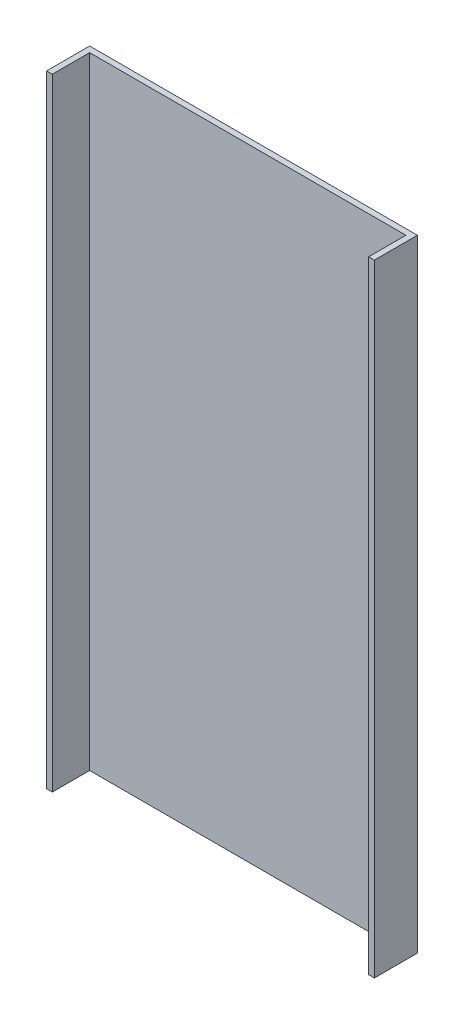
ISO-10303-21;
HEADER;
FILE_DESCRIPTION(('STEP AP214'),'2;1');
FILE_NAME('part.step','',(''),(''),'','','');
FILE_SCHEMA(('AUTOMOTIVE_DESIGN { 1 0 10303 214 1 1 1 1 }'));
ENDSEC;
DATA;
#1=APPLICATION_CONTEXT('core data for automotive mechanical design processes');
#2=APPLICATION_PROTOCOL_DEFINITION('international standard','automotive_design',2000,#1);
#3=PRODUCT_CONTEXT('',#1,'mechanical');
#4=PRODUCT('Part','Part','',(#3));
#5=PRODUCT_RELATED_PRODUCT_CATEGORY('part','',(#4));
#6=PRODUCT_DEFINITION_FORMATION('','',#4);
#7=PRODUCT_DEFINITION_CONTEXT('part definition',#1,'design');
#8=PRODUCT_DEFINITION('design','',#6,#7);
#9=PRODUCT_DEFINITION_SHAPE('','',#8);
#10=(LENGTH_UNIT() NAMED_UNIT(*) SI_UNIT(.MILLI.,.METRE.));
#11=(NAMED_UNIT(*) PLANE_ANGLE_UNIT() SI_UNIT($,.RADIAN.));
#12=(NAMED_UNIT(*) SI_UNIT($,.STERADIAN.) SOLID_ANGLE_UNIT());
#13=UNCERTAINTY_MEASURE_WITH_UNIT(LENGTH_MEASURE(1.E-05),#10,'distance_accuracy_value','');
#14=(GEOMETRIC_REPRESENTATION_CONTEXT(3) GLOBAL_UNCERTAINTY_ASSIGNED_CONTEXT((#13)) GLOBAL_UNIT_ASSIGNED_CONTEXT((#10,
#11,#12)) REPRESENTATION_CONTEXT('',''));
#15=CARTESIAN_POINT('',(0.,0.,0.));
#16=DIRECTION('',(0.,0.,1.));
#17=DIRECTION('',(1.,0.,0.));
#18=AXIS2_PLACEMENT_3D('',#15,#16,#17);
#19=CARTESIAN_POINT('',(0.,0.,1.27));
#20=DIRECTION('',(0.,0.,-1.));
#21=DIRECTION('',(-1.,0.,0.));
#22=AXIS2_PLACEMENT_3D('',#19,#20,#21);
#23=PLANE('',#22);
#24=DIRECTION('',(0.,1.,0.));
#25=VECTOR('',#24,1.);
#26=CARTESIAN_POINT('',(1.27,137.44,1.27));
#27=LINE('',#26,#25);
#28=CARTESIAN_POINT('',(1.27000000000001,0.,1.27));
#29=VERTEX_POINT('',#28);
#30=CARTESIAN_POINT('',(1.27,137.44,1.27));
#31=VERTEX_POINT('',#30);
#32=EDGE_CURVE('E59',#29,#31,#27,.T.);
#33=ORIENTED_EDGE('',*,*,#32,.F.);
#34=DIRECTION('',(1.,0.,0.));
#35=VECTOR('',#34,1.);
#36=CARTESIAN_POINT('',(0.,0.,1.27));
#37=LINE('',#36,#35);
#38=CARTESIAN_POINT('',(71.19,0.,1.27));
#39=VERTEX_POINT('',#38);
#40=EDGE_CURVE('E149',#29,#39,#37,.T.);
#41=ORIENTED_EDGE('',*,*,#40,.T.);
#42=DIRECTION('',(0.,-1.,0.));
#43=VECTOR('',#42,1.);
#44=CARTESIAN_POINT('',(71.19,0.,1.27));
#45=LINE('',#44,#43);
#46=CARTESIAN_POINT('',(71.19,137.44,1.27));
#47=VERTEX_POINT('',#46);
#48=EDGE_CURVE('E54',#47,#39,#45,.T.);
#49=ORIENTED_EDGE('',*,*,#48,.F.);
#50=DIRECTION('',(-1.,0.,0.));
#51=VECTOR('',#50,1.);
#52=CARTESIAN_POINT('',(0.,137.44,1.27));
#53=LINE('',#52,#51);
#54=EDGE_CURVE('E151',#47,#31,#53,.T.);
#55=ORIENTED_EDGE('',*,*,#54,.T.);
#56=EDGE_LOOP('',(#33,#41,#49,#55));
#57=FACE_BOUND('',#56,.T.);
#58=ADVANCED_FACE('F39',(#57),#23,.F.);
#59=CARTESIAN_POINT('',(0.,0.,1.27));
#60=DIRECTION('',(1.,0.,0.));
#61=DIRECTION('',(0.,0.,-1.));
#62=AXIS2_PLACEMENT_3D('',#59,#60,#61);
#63=PLANE('',#62);
#64=DIRECTION('',(0.,-1.,0.));
#65=VECTOR('',#64,1.);
#66=CARTESIAN_POINT('',(0.,0.,0.));
#67=LINE('',#66,#65);
#68=CARTESIAN_POINT('',(0.,137.44,0.));
#69=VERTEX_POINT('',#68);
#70=CARTESIAN_POINT('',(0.,0.,0.));
#71=VERTEX_POINT('',#70);
#72=EDGE_CURVE('E108',#69,#71,#67,.T.);
#73=ORIENTED_EDGE('',*,*,#72,.T.);
#74=DIRECTION('',(0.,0.,-1.));
#75=VECTOR('',#74,1.);
#76=CARTESIAN_POINT('',(0.,0.,1.27));
#77=LINE('',#76,#75);
#78=CARTESIAN_POINT('',(0.,0.,9.52));
#79=VERTEX_POINT('',#78);
#80=EDGE_CURVE('E11',#79,#71,#77,.T.);
#81=ORIENTED_EDGE('',*,*,#80,.F.);
#82=DIRECTION('',(0.,-1.,0.));
#83=VECTOR('',#82,1.);
#84=CARTESIAN_POINT('',(0.,137.44,9.52));
#85=LINE('',#84,#83);
#86=CARTESIAN_POINT('',(0.,137.44,9.52));
#87=VERTEX_POINT('',#86);
#88=EDGE_CURVE('E106',#87,#79,#85,.T.);
#89=ORIENTED_EDGE('',*,*,#88,.F.);
#90=DIRECTION('',(0.,0.,-1.));
#91=VECTOR('',#90,1.);
#92=CARTESIAN_POINT('',(0.,137.44,1.27));
#93=LINE('',#92,#91);
#94=EDGE_CURVE('E154',#87,#69,#93,.T.);
#95=ORIENTED_EDGE('',*,*,#94,.T.);
#96=EDGE_LOOP('',(#73,#81,#89,#95));
#97=FACE_BOUND('',#96,.T.);
#98=ADVANCED_FACE('F41',(#97),#63,.F.);
#99=CARTESIAN_POINT('',(0.,0.,1.27));
#100=DIRECTION('',(0.,1.,0.));
#101=DIRECTION('',(0.,0.,1.));
#102=AXIS2_PLACEMENT_3D('',#99,#100,#101);
#103=PLANE('',#102);
#104=DIRECTION('',(1.,0.,0.));
#105=VECTOR('',#104,1.);
#106=CARTESIAN_POINT('',(0.,0.,0.));
#107=LINE('',#106,#105);
#108=CARTESIAN_POINT('',(72.46,0.,0.));
#109=VERTEX_POINT('',#108);
#110=EDGE_CURVE('E156',#71,#109,#107,.T.);
#111=ORIENTED_EDGE('',*,*,#110,.T.);
#112=DIRECTION('',(0.,0.,-1.));
#113=VECTOR('',#112,1.);
#114=CARTESIAN_POINT('',(72.46,0.,1.27));
#115=LINE('',#114,#113);
#116=CARTESIAN_POINT('',(72.46,0.,9.52));
#117=VERTEX_POINT('',#116);
#118=EDGE_CURVE('E47',#117,#109,#115,.T.);
#119=ORIENTED_EDGE('',*,*,#118,.F.);
#120=DIRECTION('',(1.,0.,0.));
#121=VECTOR('',#120,1.);
#122=CARTESIAN_POINT('',(72.46,0.,9.52));
#123=LINE('',#122,#121);
#124=CARTESIAN_POINT('',(71.19,0.,9.52));
#125=VERTEX_POINT('',#124);
#126=EDGE_CURVE('E138',#125,#117,#123,.T.);
#127=ORIENTED_EDGE('',*,*,#126,.F.);
#128=DIRECTION('',(0.,0.,-1.));
#129=VECTOR('',#128,1.);
#130=CARTESIAN_POINT('',(71.19,0.,9.52));
#131=LINE('',#130,#129);
#132=EDGE_CURVE('E135',#125,#39,#131,.T.);
#133=ORIENTED_EDGE('',*,*,#132,.T.);
#134=ORIENTED_EDGE('',*,*,#40,.F.);
#135=DIRECTION('',(0.,0.,-1.));
#136=VECTOR('',#135,1.);
#137=CARTESIAN_POINT('',(1.27000000000001,0.,9.52));
#138=LINE('',#137,#136);
#139=CARTESIAN_POINT('',(1.27000000000001,0.,9.52));
#140=VERTEX_POINT('',#139);
#141=EDGE_CURVE('E114',#140,#29,#138,.T.);
#142=ORIENTED_EDGE('',*,*,#141,.F.);
#143=DIRECTION('',(1.,0.,0.));
#144=VECTOR('',#143,1.);
#145=CARTESIAN_POINT('',(0.,0.,9.52));
#146=LINE('',#145,#144);
#147=EDGE_CURVE('E111',#79,#140,#146,.T.);
#148=ORIENTED_EDGE('',*,*,#147,.F.);
#149=ORIENTED_EDGE('',*,*,#80,.T.);
#150=EDGE_LOOP('',(#111,#119,#127,#133,#134,#142,#148,#149));
#151=FACE_BOUND('',#150,.T.);
#152=ADVANCED_FACE('F112',(#151),#103,.F.);
#153=CARTESIAN_POINT('',(72.46,0.,1.27));
#154=DIRECTION('',(-1.,0.,0.));
#155=DIRECTION('',(0.,0.,1.));
#156=AXIS2_PLACEMENT_3D('',#153,#154,#155);
#157=PLANE('',#156);
#158=DIRECTION('',(0.,1.,0.));
#159=VECTOR('',#158,1.);
#160=CARTESIAN_POINT('',(72.46,0.,0.));
#161=LINE('',#160,#159);
#162=CARTESIAN_POINT('',(72.46,137.44,0.));
#163=VERTEX_POINT('',#162);
#164=EDGE_CURVE('E158',#109,#163,#161,.T.);
#165=ORIENTED_EDGE('',*,*,#164,.T.);
#166=DIRECTION('',(0.,0.,-1.));
#167=VECTOR('',#166,1.);
#168=CARTESIAN_POINT('',(72.46,137.44,1.27));
#169=LINE('',#168,#167);
#170=CARTESIAN_POINT('',(72.46,137.44,9.52));
#171=VERTEX_POINT('',#170);
#172=EDGE_CURVE('E162',#171,#163,#169,.T.);
#173=ORIENTED_EDGE('',*,*,#172,.F.);
#174=DIRECTION('',(0.,1.,0.));
#175=VECTOR('',#174,1.);
#176=CARTESIAN_POINT('',(72.46,0.,9.52));
#177=LINE('',#176,#175);
#178=EDGE_CURVE('E140',#117,#171,#177,.T.);
#179=ORIENTED_EDGE('',*,*,#178,.F.);
#180=ORIENTED_EDGE('',*,*,#118,.T.);
#181=EDGE_LOOP('',(#165,#173,#179,#180));
#182=FACE_BOUND('',#181,.T.);
#183=ADVANCED_FACE('F168',(#182),#157,.F.);
#184=CARTESIAN_POINT('',(0.,137.44,1.27));
#185=DIRECTION('',(0.,-1.,0.));
#186=DIRECTION('',(0.,0.,-1.));
#187=AXIS2_PLACEMENT_3D('',#184,#185,#186);
#188=PLANE('',#187);
#189=DIRECTION('',(-1.,0.,0.));
#190=VECTOR('',#189,1.);
#191=CARTESIAN_POINT('',(0.,137.44,0.));
#192=LINE('',#191,#190);
#193=EDGE_CURVE('E152',#163,#69,#192,.T.);
#194=ORIENTED_EDGE('',*,*,#193,.T.);
#195=ORIENTED_EDGE('',*,*,#94,.F.);
#196=DIRECTION('',(-1.,0.,0.));
#197=VECTOR('',#196,1.);
#198=CARTESIAN_POINT('',(0.,137.44,9.52));
#199=LINE('',#198,#197);
#200=CARTESIAN_POINT('',(1.27,137.44,9.52));
#201=VERTEX_POINT('',#200);
#202=EDGE_CURVE('E122',#201,#87,#199,.T.);
#203=ORIENTED_EDGE('',*,*,#202,.F.);
#204=DIRECTION('',(0.,0.,-1.));
#205=VECTOR('',#204,1.);
#206=CARTESIAN_POINT('',(1.27,137.44,9.52));
#207=LINE('',#206,#205);
#208=EDGE_CURVE('E127',#201,#31,#207,.T.);
#209=ORIENTED_EDGE('',*,*,#208,.T.);
#210=ORIENTED_EDGE('',*,*,#54,.F.);
#211=DIRECTION('',(0.,0.,-1.));
#212=VECTOR('',#211,1.);
#213=CARTESIAN_POINT('',(71.19,137.44,9.52));
#214=LINE('',#213,#212);
#215=CARTESIAN_POINT('',(71.19,137.44,9.52));
#216=VERTEX_POINT('',#215);
#217=EDGE_CURVE('E132',#216,#47,#214,.T.);
#218=ORIENTED_EDGE('',*,*,#217,.F.);
#219=DIRECTION('',(-1.,0.,0.));
#220=VECTOR('',#219,1.);
#221=CARTESIAN_POINT('',(72.46,137.44,9.52));
#222=LINE('',#221,#220);
#223=EDGE_CURVE('E145',#171,#216,#222,.T.);
#224=ORIENTED_EDGE('',*,*,#223,.F.);
#225=ORIENTED_EDGE('',*,*,#172,.T.);
#226=EDGE_LOOP('',(#194,#195,#203,#209,#210,#218,#224,#225));
#227=FACE_BOUND('',#226,.T.);
#228=ADVANCED_FACE('F174',(#227),#188,.F.);
#229=CARTESIAN_POINT('',(0.,0.,0.));
#230=DIRECTION('',(0.,0.,-1.));
#231=DIRECTION('',(-1.,0.,0.));
#232=AXIS2_PLACEMENT_3D('',#229,#230,#231);
#233=PLANE('',#232);
#234=ORIENTED_EDGE('',*,*,#72,.F.);
#235=ORIENTED_EDGE('',*,*,#193,.F.);
#236=ORIENTED_EDGE('',*,*,#164,.F.);
#237=ORIENTED_EDGE('',*,*,#110,.F.);
#238=EDGE_LOOP('',(#234,#235,#236,#237));
#239=FACE_BOUND('',#238,.T.);
#240=ADVANCED_FACE('F172',(#239),#233,.T.);
#241=CARTESIAN_POINT('',(71.19,0.,9.52));
#242=DIRECTION('',(1.,0.,0.));
#243=DIRECTION('',(0.,0.,-1.));
#244=AXIS2_PLACEMENT_3D('',#241,#242,#243);
#245=PLANE('',#244);
#246=ORIENTED_EDGE('',*,*,#48,.T.);
#247=ORIENTED_EDGE('',*,*,#132,.F.);
#248=DIRECTION('',(0.,-1.,0.));
#249=VECTOR('',#248,1.);
#250=CARTESIAN_POINT('',(71.19,0.,9.52));
#251=LINE('',#250,#249);
#252=EDGE_CURVE('E143',#216,#125,#251,.T.);
#253=ORIENTED_EDGE('',*,*,#252,.F.);
#254=ORIENTED_EDGE('',*,*,#217,.T.);
#255=EDGE_LOOP('',(#246,#247,#253,#254));
#256=FACE_BOUND('',#255,.T.);
#257=ADVANCED_FACE('F182',(#256),#245,.F.);
#258=CARTESIAN_POINT('',(0.,0.,9.52));
#259=DIRECTION('',(0.,0.,1.));
#260=DIRECTION('',(1.,0.,0.));
#261=AXIS2_PLACEMENT_3D('',#258,#259,#260);
#262=PLANE('',#261);
#263=ORIENTED_EDGE('',*,*,#178,.T.);
#264=ORIENTED_EDGE('',*,*,#223,.T.);
#265=ORIENTED_EDGE('',*,*,#252,.T.);
#266=ORIENTED_EDGE('',*,*,#126,.T.);
#267=EDGE_LOOP('',(#263,#264,#265,#266));
#268=FACE_BOUND('',#267,.T.);
#269=ADVANCED_FACE('F179',(#268),#262,.T.);
#270=CARTESIAN_POINT('',(1.27,137.44,9.52));
#271=DIRECTION('',(-1.,0.,0.));
#272=DIRECTION('',(0.,-1.,0.));
#273=AXIS2_PLACEMENT_3D('',#270,#271,#272);
#274=PLANE('',#273);
#275=ORIENTED_EDGE('',*,*,#32,.T.);
#276=ORIENTED_EDGE('',*,*,#208,.F.);
#277=DIRECTION('',(0.,1.,0.));
#278=VECTOR('',#277,1.);
#279=CARTESIAN_POINT('',(1.27,137.44,9.52));
#280=LINE('',#279,#278);
#281=EDGE_CURVE('E117',#140,#201,#280,.T.);
#282=ORIENTED_EDGE('',*,*,#281,.F.);
#283=ORIENTED_EDGE('',*,*,#141,.T.);
#284=EDGE_LOOP('',(#275,#276,#282,#283));
#285=FACE_BOUND('',#284,.T.);
#286=ADVANCED_FACE('F189',(#285),#274,.F.);
#287=CARTESIAN_POINT('',(0.,0.,9.52));
#288=DIRECTION('',(0.,0.,1.));
#289=DIRECTION('',(1.,0.,0.));
#290=AXIS2_PLACEMENT_3D('',#287,#288,#289);
#291=PLANE('',#290);
#292=ORIENTED_EDGE('',*,*,#88,.T.);
#293=ORIENTED_EDGE('',*,*,#147,.T.);
#294=ORIENTED_EDGE('',*,*,#281,.T.);
#295=ORIENTED_EDGE('',*,*,#202,.T.);
#296=EDGE_LOOP('',(#292,#293,#294,#295));
#297=FACE_BOUND('',#296,.T.);
#298=ADVANCED_FACE('F120',(#297),#291,.T.);
#299=CLOSED_SHELL('',(#58,#98,#152,#183,#228,#240,#257,#269,#286,#298));
#300=MANIFOLD_SOLID_BREP('B2',#299);
#301=ADVANCED_BREP_SHAPE_REPRESENTATION('',(#18,#300),#14);
#302=SHAPE_DEFINITION_REPRESENTATION(#9,#301);
ENDSEC;
END-ISO-10303-21;
